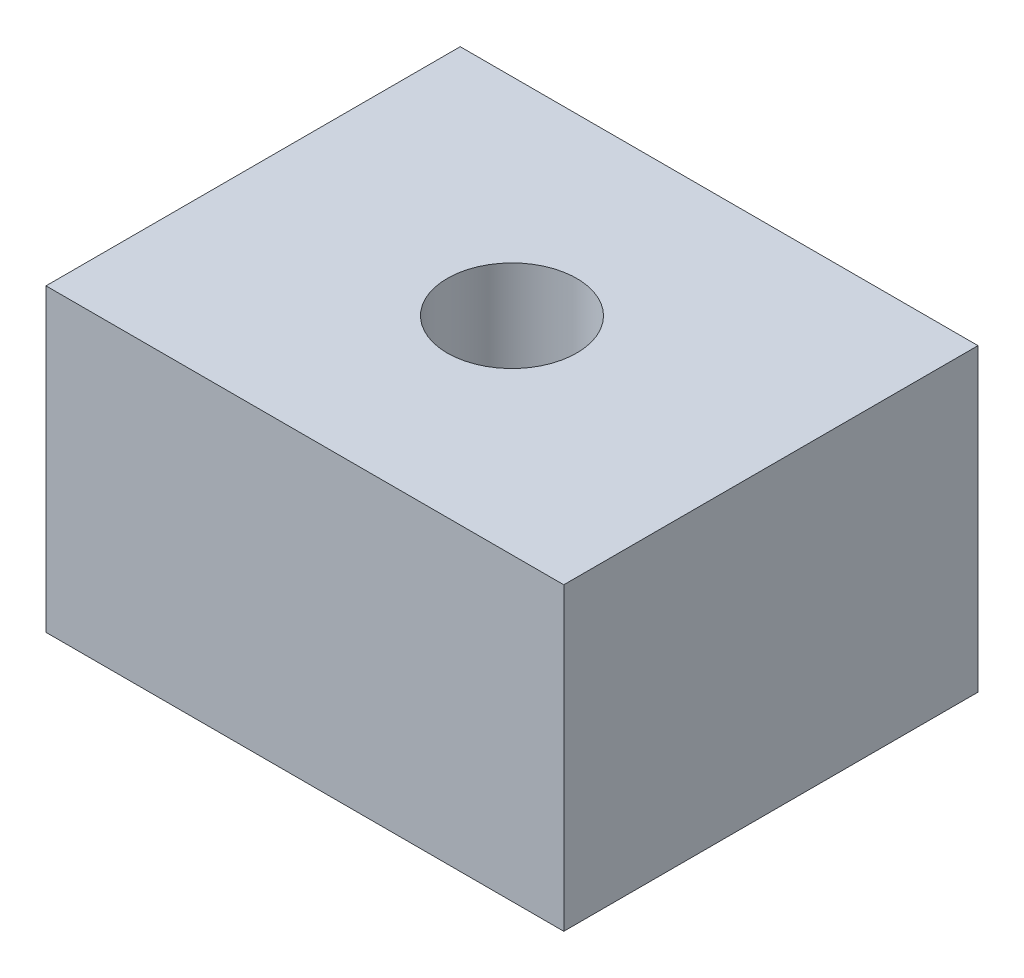
ISO-10303-21;
HEADER;
FILE_DESCRIPTION(('STEP AP214'),'2;1');
FILE_NAME('part.step','',(''),(''),'','','');
FILE_SCHEMA(('AUTOMOTIVE_DESIGN { 1 0 10303 214 1 1 1 1 }'));
ENDSEC;
DATA;
#1=APPLICATION_CONTEXT('core data for automotive mechanical design processes');
#2=APPLICATION_PROTOCOL_DEFINITION('international standard','automotive_design',2000,#1);
#3=PRODUCT_CONTEXT('',#1,'mechanical');
#4=PRODUCT('Part','Part','',(#3));
#5=PRODUCT_RELATED_PRODUCT_CATEGORY('part','',(#4));
#6=PRODUCT_DEFINITION_FORMATION('','',#4);
#7=PRODUCT_DEFINITION_CONTEXT('part definition',#1,'design');
#8=PRODUCT_DEFINITION('design','',#6,#7);
#9=PRODUCT_DEFINITION_SHAPE('','',#8);
#10=(LENGTH_UNIT() NAMED_UNIT(*) SI_UNIT(.MILLI.,.METRE.));
#11=(NAMED_UNIT(*) PLANE_ANGLE_UNIT() SI_UNIT($,.RADIAN.));
#12=(NAMED_UNIT(*) SI_UNIT($,.STERADIAN.) SOLID_ANGLE_UNIT());
#13=UNCERTAINTY_MEASURE_WITH_UNIT(LENGTH_MEASURE(1.E-05),#10,'distance_accuracy_value','');
#14=(GEOMETRIC_REPRESENTATION_CONTEXT(3) GLOBAL_UNCERTAINTY_ASSIGNED_CONTEXT((#13)) GLOBAL_UNIT_ASSIGNED_CONTEXT((#10,
#11,#12)) REPRESENTATION_CONTEXT('',''));
#15=CARTESIAN_POINT('',(0.,0.,0.));
#16=DIRECTION('',(0.,0.,1.));
#17=DIRECTION('',(1.,0.,0.));
#18=AXIS2_PLACEMENT_3D('',#15,#16,#17);
#19=CARTESIAN_POINT('',(0.,14.722475,0.));
#20=DIRECTION('',(0.,-1.,0.));
#21=DIRECTION('',(0.,0.,-1.));
#22=AXIS2_PLACEMENT_3D('',#19,#20,#21);
#23=PLANE('',#22);
#24=DIRECTION('',(0.,0.,-1.));
#25=VECTOR('',#24,1.);
#26=CARTESIAN_POINT('',(12.7,14.722475,10.16));
#27=LINE('',#26,#25);
#28=CARTESIAN_POINT('',(12.7,14.722475,10.16));
#29=VERTEX_POINT('',#28);
#30=CARTESIAN_POINT('',(12.7,14.722475,-10.16));
#31=VERTEX_POINT('',#30);
#32=EDGE_CURVE('E85',#29,#31,#27,.T.);
#33=ORIENTED_EDGE('',*,*,#32,.T.);
#34=DIRECTION('',(-1.,0.,0.));
#35=VECTOR('',#34,1.);
#36=CARTESIAN_POINT('',(-12.7,14.722475,-10.16));
#37=LINE('',#36,#35);
#38=CARTESIAN_POINT('',(-12.7,14.722475,-10.16));
#39=VERTEX_POINT('',#38);
#40=EDGE_CURVE('E80',#31,#39,#37,.T.);
#41=ORIENTED_EDGE('',*,*,#40,.T.);
#42=DIRECTION('',(0.,0.,1.));
#43=VECTOR('',#42,1.);
#44=CARTESIAN_POINT('',(-12.7,14.722475,10.16));
#45=LINE('',#44,#43);
#46=CARTESIAN_POINT('',(-12.7,14.722475,10.16));
#47=VERTEX_POINT('',#46);
#48=EDGE_CURVE('E83',#39,#47,#45,.T.);
#49=ORIENTED_EDGE('',*,*,#48,.T.);
#50=DIRECTION('',(1.,0.,0.));
#51=VECTOR('',#50,1.);
#52=CARTESIAN_POINT('',(-12.7,14.722475,10.16));
#53=LINE('',#52,#51);
#54=EDGE_CURVE('E50',#47,#29,#53,.T.);
#55=ORIENTED_EDGE('',*,*,#54,.T.);
#56=EDGE_LOOP('',(#33,#41,#49,#55));
#57=FACE_BOUND('',#56,.T.);
#58=CARTESIAN_POINT('',(0.,14.722475,0.));
#59=DIRECTION('',(0.,1.,0.));
#60=DIRECTION('',(0.,0.,1.));
#61=AXIS2_PLACEMENT_3D('',#58,#59,#60);
#62=CIRCLE('',#61,3.175);
#63=CARTESIAN_POINT('',(0.,14.722475,3.17499999999999));
#64=VERTEX_POINT('',#63);
#65=EDGE_CURVE('E100',#64,#64,#62,.T.);
#66=ORIENTED_EDGE('',*,*,#65,.F.);
#67=EDGE_LOOP('',(#66));
#68=FACE_BOUND('',#67,.T.);
#69=ADVANCED_FACE('F33',(#57,#68),#23,.F.);
#70=CARTESIAN_POINT('',(0.,0.,0.));
#71=DIRECTION('',(0.,-1.,0.));
#72=DIRECTION('',(0.,0.,-1.));
#73=AXIS2_PLACEMENT_3D('',#70,#71,#72);
#74=PLANE('',#73);
#75=DIRECTION('',(0.,0.,-1.));
#76=VECTOR('',#75,1.);
#77=CARTESIAN_POINT('',(12.7,0.,10.16));
#78=LINE('',#77,#76);
#79=CARTESIAN_POINT('',(12.7,0.,10.16));
#80=VERTEX_POINT('',#79);
#81=CARTESIAN_POINT('',(12.7,0.,-10.16));
#82=VERTEX_POINT('',#81);
#83=EDGE_CURVE('E97',#80,#82,#78,.T.);
#84=ORIENTED_EDGE('',*,*,#83,.F.);
#85=DIRECTION('',(1.,0.,0.));
#86=VECTOR('',#85,1.);
#87=CARTESIAN_POINT('',(-12.7,0.,10.16));
#88=LINE('',#87,#86);
#89=CARTESIAN_POINT('',(-12.7,0.,10.16));
#90=VERTEX_POINT('',#89);
#91=EDGE_CURVE('E73',#90,#80,#88,.T.);
#92=ORIENTED_EDGE('',*,*,#91,.F.);
#93=DIRECTION('',(0.,0.,1.));
#94=VECTOR('',#93,1.);
#95=CARTESIAN_POINT('',(-12.7,0.,10.16));
#96=LINE('',#95,#94);
#97=CARTESIAN_POINT('',(-12.7,0.,-10.16));
#98=VERTEX_POINT('',#97);
#99=EDGE_CURVE('E67',#98,#90,#96,.T.);
#100=ORIENTED_EDGE('',*,*,#99,.F.);
#101=DIRECTION('',(-1.,0.,0.));
#102=VECTOR('',#101,1.);
#103=CARTESIAN_POINT('',(-12.7,0.,-10.16));
#104=LINE('',#103,#102);
#105=EDGE_CURVE('E89',#82,#98,#104,.T.);
#106=ORIENTED_EDGE('',*,*,#105,.F.);
#107=EDGE_LOOP('',(#84,#92,#100,#106));
#108=FACE_BOUND('',#107,.T.);
#109=CARTESIAN_POINT('',(0.,0.,0.));
#110=DIRECTION('',(0.,1.,0.));
#111=DIRECTION('',(0.,0.,1.));
#112=AXIS2_PLACEMENT_3D('',#109,#110,#111);
#113=CIRCLE('',#112,3.175);
#114=CARTESIAN_POINT('',(0.,0.,3.17499999999999));
#115=VERTEX_POINT('',#114);
#116=EDGE_CURVE('E112',#115,#115,#113,.T.);
#117=ORIENTED_EDGE('',*,*,#116,.T.);
#118=EDGE_LOOP('',(#117));
#119=FACE_BOUND('',#118,.T.);
#120=ADVANCED_FACE('F108',(#108,#119),#74,.T.);
#121=CARTESIAN_POINT('',(12.7,14.722475,10.16));
#122=DIRECTION('',(-1.,0.,0.));
#123=DIRECTION('',(0.,0.,1.));
#124=AXIS2_PLACEMENT_3D('',#121,#122,#123);
#125=PLANE('',#124);
#126=ORIENTED_EDGE('',*,*,#83,.T.);
#127=DIRECTION('',(0.,-1.,0.));
#128=VECTOR('',#127,1.);
#129=CARTESIAN_POINT('',(12.7,14.722475,-10.16));
#130=LINE('',#129,#128);
#131=EDGE_CURVE('E11',#31,#82,#130,.T.);
#132=ORIENTED_EDGE('',*,*,#131,.F.);
#133=ORIENTED_EDGE('',*,*,#32,.F.);
#134=DIRECTION('',(0.,-1.,0.));
#135=VECTOR('',#134,1.);
#136=CARTESIAN_POINT('',(12.7,14.722475,10.16));
#137=LINE('',#136,#135);
#138=EDGE_CURVE('E93',#29,#80,#137,.T.);
#139=ORIENTED_EDGE('',*,*,#138,.T.);
#140=EDGE_LOOP('',(#126,#132,#133,#139));
#141=FACE_BOUND('',#140,.T.);
#142=ADVANCED_FACE('F35',(#141),#125,.F.);
#143=CARTESIAN_POINT('',(-12.7,14.722475,-10.16));
#144=DIRECTION('',(0.,0.,1.));
#145=DIRECTION('',(1.,0.,0.));
#146=AXIS2_PLACEMENT_3D('',#143,#144,#145);
#147=PLANE('',#146);
#148=ORIENTED_EDGE('',*,*,#105,.T.);
#149=DIRECTION('',(0.,-1.,0.));
#150=VECTOR('',#149,1.);
#151=CARTESIAN_POINT('',(-12.7,14.722475,-10.16));
#152=LINE('',#151,#150);
#153=EDGE_CURVE('E42',#39,#98,#152,.T.);
#154=ORIENTED_EDGE('',*,*,#153,.F.);
#155=ORIENTED_EDGE('',*,*,#40,.F.);
#156=ORIENTED_EDGE('',*,*,#131,.T.);
#157=EDGE_LOOP('',(#148,#154,#155,#156));
#158=FACE_BOUND('',#157,.T.);
#159=ADVANCED_FACE('F88',(#158),#147,.F.);
#160=CARTESIAN_POINT('',(-12.7,14.722475,10.16));
#161=DIRECTION('',(1.,0.,0.));
#162=DIRECTION('',(0.,0.,-1.));
#163=AXIS2_PLACEMENT_3D('',#160,#161,#162);
#164=PLANE('',#163);
#165=ORIENTED_EDGE('',*,*,#99,.T.);
#166=DIRECTION('',(0.,-1.,0.));
#167=VECTOR('',#166,1.);
#168=CARTESIAN_POINT('',(-12.7,14.722475,10.16));
#169=LINE('',#168,#167);
#170=EDGE_CURVE('E90',#47,#90,#169,.T.);
#171=ORIENTED_EDGE('',*,*,#170,.F.);
#172=ORIENTED_EDGE('',*,*,#48,.F.);
#173=ORIENTED_EDGE('',*,*,#153,.T.);
#174=EDGE_LOOP('',(#165,#171,#172,#173));
#175=FACE_BOUND('',#174,.T.);
#176=ADVANCED_FACE('F91',(#175),#164,.F.);
#177=CARTESIAN_POINT('',(-12.7,14.722475,10.16));
#178=DIRECTION('',(0.,0.,-1.));
#179=DIRECTION('',(-1.,0.,0.));
#180=AXIS2_PLACEMENT_3D('',#177,#178,#179);
#181=PLANE('',#180);
#182=ORIENTED_EDGE('',*,*,#91,.T.);
#183=ORIENTED_EDGE('',*,*,#138,.F.);
#184=ORIENTED_EDGE('',*,*,#54,.F.);
#185=ORIENTED_EDGE('',*,*,#170,.T.);
#186=EDGE_LOOP('',(#182,#183,#184,#185));
#187=FACE_BOUND('',#186,.T.);
#188=ADVANCED_FACE('F105',(#187),#181,.F.);
#189=CARTESIAN_POINT('',(0.,14.722475,0.));
#190=DIRECTION('',(0.,-1.,0.));
#191=DIRECTION('',(0.,0.,-1.));
#192=AXIS2_PLACEMENT_3D('',#189,#190,#191);
#193=CYLINDRICAL_SURFACE('',#192,3.175);
#194=ORIENTED_EDGE('',*,*,#65,.T.);
#195=EDGE_LOOP('',(#194));
#196=FACE_BOUND('',#195,.T.);
#197=ORIENTED_EDGE('',*,*,#116,.F.);
#198=EDGE_LOOP('',(#197));
#199=FACE_BOUND('',#198,.T.);
#200=ADVANCED_FACE('F118',(#196,#199),#193,.F.);
#201=CLOSED_SHELL('',(#69,#120,#142,#159,#176,#188,#200));
#202=MANIFOLD_SOLID_BREP('B2',#201);
#203=ADVANCED_BREP_SHAPE_REPRESENTATION('',(#18,#202),#14);
#204=SHAPE_DEFINITION_REPRESENTATION(#9,#203);
ENDSEC;
END-ISO-10303-21;
